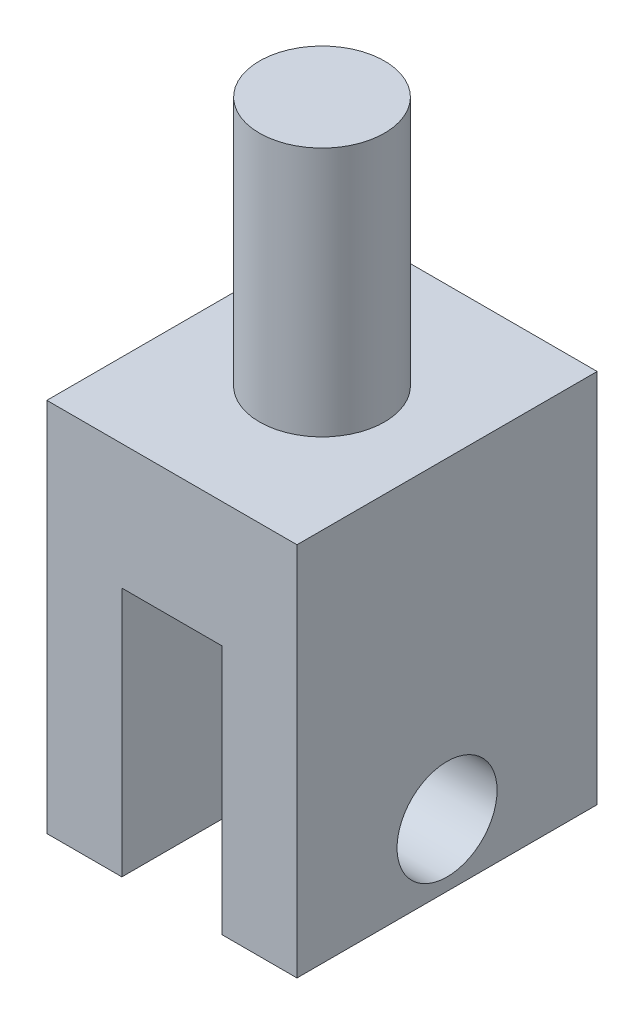
ISO-10303-21;
HEADER;
FILE_DESCRIPTION(('STEP AP214'),'2;1');
FILE_NAME('part.step','',(''),(''),'','','');
FILE_SCHEMA(('AUTOMOTIVE_DESIGN { 1 0 10303 214 1 1 1 1 }'));
ENDSEC;
DATA;
#1=APPLICATION_CONTEXT('core data for automotive mechanical design processes');
#2=APPLICATION_PROTOCOL_DEFINITION('international standard','automotive_design',2000,#1);
#3=PRODUCT_CONTEXT('',#1,'mechanical');
#4=PRODUCT('Part','Part','',(#3));
#5=PRODUCT_RELATED_PRODUCT_CATEGORY('part','',(#4));
#6=PRODUCT_DEFINITION_FORMATION('','',#4);
#7=PRODUCT_DEFINITION_CONTEXT('part definition',#1,'design');
#8=PRODUCT_DEFINITION('design','',#6,#7);
#9=PRODUCT_DEFINITION_SHAPE('','',#8);
#10=(LENGTH_UNIT() NAMED_UNIT(*) SI_UNIT(.MILLI.,.METRE.));
#11=(NAMED_UNIT(*) PLANE_ANGLE_UNIT() SI_UNIT($,.RADIAN.));
#12=(NAMED_UNIT(*) SI_UNIT($,.STERADIAN.) SOLID_ANGLE_UNIT());
#13=UNCERTAINTY_MEASURE_WITH_UNIT(LENGTH_MEASURE(1.E-05),#10,'distance_accuracy_value','');
#14=(GEOMETRIC_REPRESENTATION_CONTEXT(3) GLOBAL_UNCERTAINTY_ASSIGNED_CONTEXT((#13)) GLOBAL_UNIT_ASSIGNED_CONTEXT((#10,
#11,#12)) REPRESENTATION_CONTEXT('',''));
#15=CARTESIAN_POINT('',(0.,0.,0.));
#16=DIRECTION('',(0.,0.,1.));
#17=DIRECTION('',(1.,0.,0.));
#18=AXIS2_PLACEMENT_3D('',#15,#16,#17);
#19=CARTESIAN_POINT('',(0.,100.,0.));
#20=DIRECTION('',(0.,1.,0.));
#21=DIRECTION('',(0.,0.,1.));
#22=AXIS2_PLACEMENT_3D('',#19,#20,#21);
#23=PLANE('',#22);
#24=DIRECTION('',(0.,0.,1.));
#25=VECTOR('',#24,1.);
#26=CARTESIAN_POINT('',(20.,100.,-60.));
#27=LINE('',#26,#25);
#28=CARTESIAN_POINT('',(20.,100.,-60.));
#29=VERTEX_POINT('',#28);
#30=CARTESIAN_POINT('',(20.,100.,60.));
#31=VERTEX_POINT('',#30);
#32=EDGE_CURVE('E148',#29,#31,#27,.T.);
#33=ORIENTED_EDGE('',*,*,#32,.T.);
#34=DIRECTION('',(1.,0.,0.));
#35=VECTOR('',#34,1.);
#36=CARTESIAN_POINT('',(-50.,100.,60.));
#37=LINE('',#36,#35);
#38=CARTESIAN_POINT('',(-20.,100.,60.));
#39=VERTEX_POINT('',#38);
#40=EDGE_CURVE('E128',#39,#31,#37,.T.);
#41=ORIENTED_EDGE('',*,*,#40,.F.);
#42=DIRECTION('',(0.,0.,-1.));
#43=VECTOR('',#42,1.);
#44=CARTESIAN_POINT('',(-20.,100.,-60.));
#45=LINE('',#44,#43);
#46=CARTESIAN_POINT('',(-20.,100.,-60.));
#47=VERTEX_POINT('',#46);
#48=EDGE_CURVE('E98',#39,#47,#45,.T.);
#49=ORIENTED_EDGE('',*,*,#48,.T.);
#50=DIRECTION('',(-1.,0.,0.));
#51=VECTOR('',#50,1.);
#52=CARTESIAN_POINT('',(-50.,100.,-60.));
#53=LINE('',#52,#51);
#54=EDGE_CURVE('E112',#29,#47,#53,.T.);
#55=ORIENTED_EDGE('',*,*,#54,.F.);
#56=EDGE_LOOP('',(#33,#41,#49,#55));
#57=FACE_BOUND('',#56,.T.);
#58=ADVANCED_FACE('F39',(#57),#23,.F.);
#59=CARTESIAN_POINT('',(-20.,100.,-60.));
#60=DIRECTION('',(-1.,0.,0.));
#61=DIRECTION('',(0.,0.,1.));
#62=AXIS2_PLACEMENT_3D('',#59,#60,#61);
#63=PLANE('',#62);
#64=CARTESIAN_POINT('',(-20.,25.,0.));
#65=DIRECTION('',(-1.,0.,0.));
#66=DIRECTION('',(0.,0.,1.));
#67=AXIS2_PLACEMENT_3D('',#64,#65,#66);
#68=CIRCLE('',#67,20.);
#69=CARTESIAN_POINT('',(-20.,25.,20.));
#70=VERTEX_POINT('',#69);
#71=EDGE_CURVE('E114',#70,#70,#68,.T.);
#72=ORIENTED_EDGE('',*,*,#71,.T.);
#73=EDGE_LOOP('',(#72));
#74=FACE_BOUND('',#73,.T.);
#75=DIRECTION('',(0.,0.,-1.));
#76=VECTOR('',#75,1.);
#77=CARTESIAN_POINT('',(-20.,0.,-60.));
#78=LINE('',#77,#76);
#79=CARTESIAN_POINT('',(-20.,0.,60.));
#80=VERTEX_POINT('',#79);
#81=CARTESIAN_POINT('',(-20.,0.,-60.));
#82=VERTEX_POINT('',#81);
#83=EDGE_CURVE('E97',#80,#82,#78,.T.);
#84=ORIENTED_EDGE('',*,*,#83,.T.);
#85=DIRECTION('',(0.,-1.,0.));
#86=VECTOR('',#85,1.);
#87=CARTESIAN_POINT('',(-20.,100.,-60.));
#88=LINE('',#87,#86);
#89=EDGE_CURVE('E49',#47,#82,#88,.T.);
#90=ORIENTED_EDGE('',*,*,#89,.F.);
#91=ORIENTED_EDGE('',*,*,#48,.F.);
#92=DIRECTION('',(0.,-1.,0.));
#93=VECTOR('',#92,1.);
#94=CARTESIAN_POINT('',(-20.,100.,60.));
#95=LINE('',#94,#93);
#96=EDGE_CURVE('E57',#39,#80,#95,.T.);
#97=ORIENTED_EDGE('',*,*,#96,.T.);
#98=EDGE_LOOP('',(#84,#90,#91,#97));
#99=FACE_BOUND('',#98,.T.);
#100=ADVANCED_FACE('F41',(#74,#99),#63,.F.);
#101=CARTESIAN_POINT('',(-50.,100.,-60.));
#102=DIRECTION('',(0.,0.,1.));
#103=DIRECTION('',(1.,0.,0.));
#104=AXIS2_PLACEMENT_3D('',#101,#102,#103);
#105=PLANE('',#104);
#106=DIRECTION('',(-1.,0.,0.));
#107=VECTOR('',#106,1.);
#108=CARTESIAN_POINT('',(-50.,0.,-60.));
#109=LINE('',#108,#107);
#110=CARTESIAN_POINT('',(-50.,0.,-60.));
#111=VERTEX_POINT('',#110);
#112=EDGE_CURVE('E86',#82,#111,#109,.T.);
#113=ORIENTED_EDGE('',*,*,#112,.T.);
#114=DIRECTION('',(0.,-1.,0.));
#115=VECTOR('',#114,1.);
#116=CARTESIAN_POINT('',(-50.,100.,-60.));
#117=LINE('',#116,#115);
#118=CARTESIAN_POINT('',(-50.,150.,-60.));
#119=VERTEX_POINT('',#118);
#120=EDGE_CURVE('E82',#119,#111,#117,.T.);
#121=ORIENTED_EDGE('',*,*,#120,.F.);
#122=DIRECTION('',(-1.,0.,0.));
#123=VECTOR('',#122,1.);
#124=CARTESIAN_POINT('',(-50.,150.,-60.));
#125=LINE('',#124,#123);
#126=CARTESIAN_POINT('',(50.,150.,-60.));
#127=VERTEX_POINT('',#126);
#128=EDGE_CURVE('E125',#127,#119,#125,.T.);
#129=ORIENTED_EDGE('',*,*,#128,.F.);
#130=DIRECTION('',(0.,-1.,0.));
#131=VECTOR('',#130,1.);
#132=CARTESIAN_POINT('',(50.,150.,-60.));
#133=LINE('',#132,#131);
#134=CARTESIAN_POINT('',(50.,0.,-60.));
#135=VERTEX_POINT('',#134);
#136=EDGE_CURVE('E122',#127,#135,#133,.T.);
#137=ORIENTED_EDGE('',*,*,#136,.T.);
#138=DIRECTION('',(-1.,0.,0.));
#139=VECTOR('',#138,1.);
#140=CARTESIAN_POINT('',(20.,0.,-60.));
#141=LINE('',#140,#139);
#142=CARTESIAN_POINT('',(20.,0.,-60.));
#143=VERTEX_POINT('',#142);
#144=EDGE_CURVE('E155',#135,#143,#141,.T.);
#145=ORIENTED_EDGE('',*,*,#144,.T.);
#146=DIRECTION('',(0.,-1.,0.));
#147=VECTOR('',#146,1.);
#148=CARTESIAN_POINT('',(20.,100.,-60.));
#149=LINE('',#148,#147);
#150=EDGE_CURVE('E130',#29,#143,#149,.T.);
#151=ORIENTED_EDGE('',*,*,#150,.F.);
#152=ORIENTED_EDGE('',*,*,#54,.T.);
#153=ORIENTED_EDGE('',*,*,#89,.T.);
#154=EDGE_LOOP('',(#113,#121,#129,#137,#145,#151,#152,#153));
#155=FACE_BOUND('',#154,.T.);
#156=ADVANCED_FACE('F109',(#155),#105,.F.);
#157=CARTESIAN_POINT('',(-50.,100.,-60.));
#158=DIRECTION('',(1.,0.,0.));
#159=DIRECTION('',(0.,0.,-1.));
#160=AXIS2_PLACEMENT_3D('',#157,#158,#159);
#161=PLANE('',#160);
#162=CARTESIAN_POINT('',(-50.,25.,0.));
#163=DIRECTION('',(1.,0.,0.));
#164=DIRECTION('',(0.,0.,-1.));
#165=AXIS2_PLACEMENT_3D('',#162,#163,#164);
#166=CIRCLE('',#165,20.);
#167=CARTESIAN_POINT('',(-50.,25.,-20.));
#168=VERTEX_POINT('',#167);
#169=EDGE_CURVE('E43',#168,#168,#166,.T.);
#170=ORIENTED_EDGE('',*,*,#169,.T.);
#171=EDGE_LOOP('',(#170));
#172=FACE_BOUND('',#171,.T.);
#173=DIRECTION('',(0.,0.,1.));
#174=VECTOR('',#173,1.);
#175=CARTESIAN_POINT('',(-50.,0.,-60.));
#176=LINE('',#175,#174);
#177=CARTESIAN_POINT('',(-50.,0.,60.));
#178=VERTEX_POINT('',#177);
#179=EDGE_CURVE('E74',#111,#178,#176,.T.);
#180=ORIENTED_EDGE('',*,*,#179,.T.);
#181=DIRECTION('',(0.,-1.,0.));
#182=VECTOR('',#181,1.);
#183=CARTESIAN_POINT('',(-50.,100.,60.));
#184=LINE('',#183,#182);
#185=CARTESIAN_POINT('',(-50.,150.,60.));
#186=VERTEX_POINT('',#185);
#187=EDGE_CURVE('E79',#186,#178,#184,.T.);
#188=ORIENTED_EDGE('',*,*,#187,.F.);
#189=DIRECTION('',(0.,0.,1.));
#190=VECTOR('',#189,1.);
#191=CARTESIAN_POINT('',(-50.,150.,-60.));
#192=LINE('',#191,#190);
#193=EDGE_CURVE('E127',#119,#186,#192,.T.);
#194=ORIENTED_EDGE('',*,*,#193,.F.);
#195=ORIENTED_EDGE('',*,*,#120,.T.);
#196=EDGE_LOOP('',(#180,#188,#194,#195));
#197=FACE_BOUND('',#196,.T.);
#198=ADVANCED_FACE('F76',(#172,#197),#161,.F.);
#199=CARTESIAN_POINT('',(-50.,100.,60.));
#200=DIRECTION('',(0.,0.,-1.));
#201=DIRECTION('',(-1.,0.,0.));
#202=AXIS2_PLACEMENT_3D('',#199,#200,#201);
#203=PLANE('',#202);
#204=DIRECTION('',(1.,0.,0.));
#205=VECTOR('',#204,1.);
#206=CARTESIAN_POINT('',(-50.,0.,60.));
#207=LINE('',#206,#205);
#208=EDGE_CURVE('E85',#178,#80,#207,.T.);
#209=ORIENTED_EDGE('',*,*,#208,.T.);
#210=ORIENTED_EDGE('',*,*,#96,.F.);
#211=ORIENTED_EDGE('',*,*,#40,.T.);
#212=DIRECTION('',(0.,-1.,0.));
#213=VECTOR('',#212,1.);
#214=CARTESIAN_POINT('',(20.,100.,60.));
#215=LINE('',#214,#213);
#216=CARTESIAN_POINT('',(20.,0.,60.));
#217=VERTEX_POINT('',#216);
#218=EDGE_CURVE('E145',#31,#217,#215,.T.);
#219=ORIENTED_EDGE('',*,*,#218,.T.);
#220=DIRECTION('',(1.,0.,0.));
#221=VECTOR('',#220,1.);
#222=CARTESIAN_POINT('',(20.,0.,60.));
#223=LINE('',#222,#221);
#224=CARTESIAN_POINT('',(50.,0.,60.));
#225=VERTEX_POINT('',#224);
#226=EDGE_CURVE('E149',#217,#225,#223,.T.);
#227=ORIENTED_EDGE('',*,*,#226,.T.);
#228=DIRECTION('',(0.,-1.,0.));
#229=VECTOR('',#228,1.);
#230=CARTESIAN_POINT('',(50.,150.,60.));
#231=LINE('',#230,#229);
#232=CARTESIAN_POINT('',(50.,150.,60.));
#233=VERTEX_POINT('',#232);
#234=EDGE_CURVE('E119',#233,#225,#231,.T.);
#235=ORIENTED_EDGE('',*,*,#234,.F.);
#236=DIRECTION('',(1.,0.,0.));
#237=VECTOR('',#236,1.);
#238=CARTESIAN_POINT('',(-50.,150.,60.));
#239=LINE('',#238,#237);
#240=EDGE_CURVE('E91',#186,#233,#239,.T.);
#241=ORIENTED_EDGE('',*,*,#240,.F.);
#242=ORIENTED_EDGE('',*,*,#187,.T.);
#243=EDGE_LOOP('',(#209,#210,#211,#219,#227,#235,#241,#242));
#244=FACE_BOUND('',#243,.T.);
#245=ADVANCED_FACE('F88',(#244),#203,.F.);
#246=CARTESIAN_POINT('',(0.,0.,0.));
#247=DIRECTION('',(0.,1.,0.));
#248=DIRECTION('',(0.,0.,1.));
#249=AXIS2_PLACEMENT_3D('',#246,#247,#248);
#250=PLANE('',#249);
#251=ORIENTED_EDGE('',*,*,#83,.F.);
#252=ORIENTED_EDGE('',*,*,#208,.F.);
#253=ORIENTED_EDGE('',*,*,#179,.F.);
#254=ORIENTED_EDGE('',*,*,#112,.F.);
#255=EDGE_LOOP('',(#251,#252,#253,#254));
#256=FACE_BOUND('',#255,.T.);
#257=ADVANCED_FACE('F95',(#256),#250,.F.);
#258=CARTESIAN_POINT('',(-100.,25.,0.));
#259=DIRECTION('',(1.,0.,0.));
#260=DIRECTION('',(0.,0.,-1.));
#261=AXIS2_PLACEMENT_3D('',#258,#259,#260);
#262=CYLINDRICAL_SURFACE('',#261,20.);
#263=ORIENTED_EDGE('',*,*,#169,.F.);
#264=EDGE_LOOP('',(#263));
#265=FACE_BOUND('',#264,.T.);
#266=ORIENTED_EDGE('',*,*,#71,.F.);
#267=EDGE_LOOP('',(#266));
#268=FACE_BOUND('',#267,.T.);
#269=ADVANCED_FACE('F218',(#265,#268),#262,.F.);
#270=CARTESIAN_POINT('',(50.,150.,-60.));
#271=DIRECTION('',(-1.,0.,0.));
#272=DIRECTION('',(0.,0.,1.));
#273=AXIS2_PLACEMENT_3D('',#270,#271,#272);
#274=PLANE('',#273);
#275=ORIENTED_EDGE('',*,*,#234,.T.);
#276=DIRECTION('',(0.,0.,-1.));
#277=VECTOR('',#276,1.);
#278=CARTESIAN_POINT('',(50.,0.,-60.));
#279=LINE('',#278,#277);
#280=EDGE_CURVE('E141',#225,#135,#279,.T.);
#281=ORIENTED_EDGE('',*,*,#280,.T.);
#282=ORIENTED_EDGE('',*,*,#136,.F.);
#283=DIRECTION('',(0.,0.,-1.));
#284=VECTOR('',#283,1.);
#285=CARTESIAN_POINT('',(50.,150.,-60.));
#286=LINE('',#285,#284);
#287=EDGE_CURVE('E133',#233,#127,#286,.T.);
#288=ORIENTED_EDGE('',*,*,#287,.F.);
#289=EDGE_LOOP('',(#275,#281,#282,#288));
#290=FACE_BOUND('',#289,.T.);
#291=CARTESIAN_POINT('',(50.,25.,0.));
#292=DIRECTION('',(1.,0.,0.));
#293=DIRECTION('',(0.,0.,-1.));
#294=AXIS2_PLACEMENT_3D('',#291,#292,#293);
#295=CIRCLE('',#294,20.);
#296=CARTESIAN_POINT('',(50.,25.,-20.));
#297=VERTEX_POINT('',#296);
#298=EDGE_CURVE('E142',#297,#297,#295,.T.);
#299=ORIENTED_EDGE('',*,*,#298,.F.);
#300=EDGE_LOOP('',(#299));
#301=FACE_BOUND('',#300,.T.);
#302=ADVANCED_FACE('F181',(#290,#301),#274,.F.);
#303=CARTESIAN_POINT('',(0.,150.,0.));
#304=DIRECTION('',(0.,1.,0.));
#305=DIRECTION('',(0.,0.,1.));
#306=AXIS2_PLACEMENT_3D('',#303,#304,#305);
#307=PLANE('',#306);
#308=CARTESIAN_POINT('',(0.,150.,0.));
#309=DIRECTION('',(0.,1.,0.));
#310=DIRECTION('',(0.,0.,1.));
#311=AXIS2_PLACEMENT_3D('',#308,#309,#310);
#312=CIRCLE('',#311,25.);
#313=CARTESIAN_POINT('',(0.,150.,25.));
#314=VERTEX_POINT('',#313);
#315=EDGE_CURVE('E11',#314,#314,#312,.T.);
#316=ORIENTED_EDGE('',*,*,#315,.F.);
#317=EDGE_LOOP('',(#316));
#318=FACE_BOUND('',#317,.T.);
#319=ORIENTED_EDGE('',*,*,#193,.T.);
#320=ORIENTED_EDGE('',*,*,#240,.T.);
#321=ORIENTED_EDGE('',*,*,#287,.T.);
#322=ORIENTED_EDGE('',*,*,#128,.T.);
#323=EDGE_LOOP('',(#319,#320,#321,#322));
#324=FACE_BOUND('',#323,.T.);
#325=ADVANCED_FACE('F177',(#318,#324),#307,.T.);
#326=CARTESIAN_POINT('',(20.,100.,-60.));
#327=DIRECTION('',(1.,0.,0.));
#328=DIRECTION('',(0.,0.,-1.));
#329=AXIS2_PLACEMENT_3D('',#326,#327,#328);
#330=PLANE('',#329);
#331=CARTESIAN_POINT('',(20.,25.,0.));
#332=DIRECTION('',(1.,0.,0.));
#333=DIRECTION('',(0.,0.,-1.));
#334=AXIS2_PLACEMENT_3D('',#331,#332,#333);
#335=CIRCLE('',#334,20.);
#336=CARTESIAN_POINT('',(20.,25.,-20.));
#337=VERTEX_POINT('',#336);
#338=EDGE_CURVE('E138',#337,#337,#335,.T.);
#339=ORIENTED_EDGE('',*,*,#338,.T.);
#340=EDGE_LOOP('',(#339));
#341=FACE_BOUND('',#340,.T.);
#342=DIRECTION('',(0.,0.,1.));
#343=VECTOR('',#342,1.);
#344=CARTESIAN_POINT('',(20.,0.,-60.));
#345=LINE('',#344,#343);
#346=EDGE_CURVE('E152',#143,#217,#345,.T.);
#347=ORIENTED_EDGE('',*,*,#346,.T.);
#348=ORIENTED_EDGE('',*,*,#218,.F.);
#349=ORIENTED_EDGE('',*,*,#32,.F.);
#350=ORIENTED_EDGE('',*,*,#150,.T.);
#351=EDGE_LOOP('',(#347,#348,#349,#350));
#352=FACE_BOUND('',#351,.T.);
#353=ADVANCED_FACE('F180',(#341,#352),#330,.F.);
#354=CARTESIAN_POINT('',(0.,0.,0.));
#355=DIRECTION('',(0.,1.,0.));
#356=DIRECTION('',(0.,0.,1.));
#357=AXIS2_PLACEMENT_3D('',#354,#355,#356);
#358=PLANE('',#357);
#359=ORIENTED_EDGE('',*,*,#280,.F.);
#360=ORIENTED_EDGE('',*,*,#226,.F.);
#361=ORIENTED_EDGE('',*,*,#346,.F.);
#362=ORIENTED_EDGE('',*,*,#144,.F.);
#363=EDGE_LOOP('',(#359,#360,#361,#362));
#364=FACE_BOUND('',#363,.T.);
#365=ADVANCED_FACE('F212',(#364),#358,.F.);
#366=CARTESIAN_POINT('',(-100.,25.,0.));
#367=DIRECTION('',(1.,0.,0.));
#368=DIRECTION('',(0.,0.,-1.));
#369=AXIS2_PLACEMENT_3D('',#366,#367,#368);
#370=CYLINDRICAL_SURFACE('',#369,20.);
#371=ORIENTED_EDGE('',*,*,#298,.T.);
#372=EDGE_LOOP('',(#371));
#373=FACE_BOUND('',#372,.T.);
#374=ORIENTED_EDGE('',*,*,#338,.F.);
#375=EDGE_LOOP('',(#374));
#376=FACE_BOUND('',#375,.T.);
#377=ADVANCED_FACE('F173',(#373,#376),#370,.F.);
#378=CARTESIAN_POINT('',(0.,250.,0.));
#379=DIRECTION('',(0.,-1.,0.));
#380=DIRECTION('',(0.,0.,-1.));
#381=AXIS2_PLACEMENT_3D('',#378,#379,#380);
#382=CYLINDRICAL_SURFACE('',#381,25.);
#383=CARTESIAN_POINT('',(0.,250.,0.));
#384=DIRECTION('',(0.,1.,0.));
#385=DIRECTION('',(0.,0.,1.));
#386=AXIS2_PLACEMENT_3D('',#383,#384,#385);
#387=CIRCLE('',#386,25.);
#388=CARTESIAN_POINT('',(0.,250.,25.));
#389=VERTEX_POINT('',#388);
#390=EDGE_CURVE('E163',#389,#389,#387,.T.);
#391=ORIENTED_EDGE('',*,*,#390,.F.);
#392=EDGE_LOOP('',(#391));
#393=FACE_BOUND('',#392,.T.);
#394=ORIENTED_EDGE('',*,*,#315,.T.);
#395=EDGE_LOOP('',(#394));
#396=FACE_BOUND('',#395,.T.);
#397=ADVANCED_FACE('F170',(#393,#396),#382,.T.);
#398=CARTESIAN_POINT('',(0.,250.,0.));
#399=DIRECTION('',(0.,1.,0.));
#400=DIRECTION('',(0.,0.,1.));
#401=AXIS2_PLACEMENT_3D('',#398,#399,#400);
#402=PLANE('',#401);
#403=ORIENTED_EDGE('',*,*,#390,.T.);
#404=EDGE_LOOP('',(#403));
#405=FACE_BOUND('',#404,.T.);
#406=ADVANCED_FACE('F168',(#405),#402,.T.);
#407=CLOSED_SHELL('',(#58,#100,#156,#198,#245,#257,#269,#302,#325,#353,#365,#377,#397,#406));
#408=MANIFOLD_SOLID_BREP('B2',#407);
#409=ADVANCED_BREP_SHAPE_REPRESENTATION('',(#18,#408),#14);
#410=SHAPE_DEFINITION_REPRESENTATION(#9,#409);
ENDSEC;
END-ISO-10303-21;
